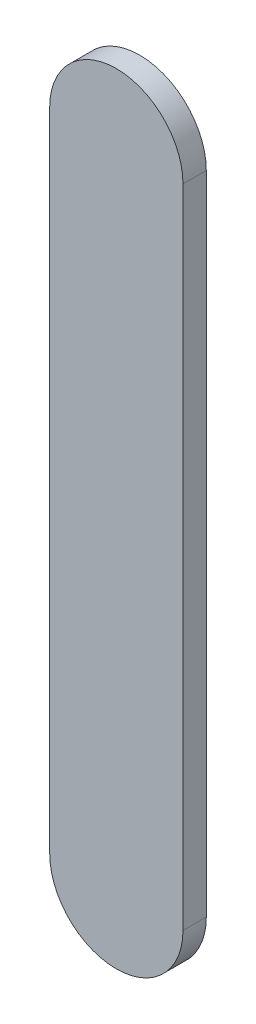
ISO-10303-21;
HEADER;
FILE_DESCRIPTION(('STEP AP214'),'2;1');
FILE_NAME('part.step','',(''),(''),'','','');
FILE_SCHEMA(('AUTOMOTIVE_DESIGN { 1 0 10303 214 1 1 1 1 }'));
ENDSEC;
DATA;
#1=APPLICATION_CONTEXT('core data for automotive mechanical design processes');
#2=APPLICATION_PROTOCOL_DEFINITION('international standard','automotive_design',2000,#1);
#3=PRODUCT_CONTEXT('',#1,'mechanical');
#4=PRODUCT('Part','Part','',(#3));
#5=PRODUCT_RELATED_PRODUCT_CATEGORY('part','',(#4));
#6=PRODUCT_DEFINITION_FORMATION('','',#4);
#7=PRODUCT_DEFINITION_CONTEXT('part definition',#1,'design');
#8=PRODUCT_DEFINITION('design','',#6,#7);
#9=PRODUCT_DEFINITION_SHAPE('','',#8);
#10=(LENGTH_UNIT() NAMED_UNIT(*) SI_UNIT(.MILLI.,.METRE.));
#11=(NAMED_UNIT(*) PLANE_ANGLE_UNIT() SI_UNIT($,.RADIAN.));
#12=(NAMED_UNIT(*) SI_UNIT($,.STERADIAN.) SOLID_ANGLE_UNIT());
#13=UNCERTAINTY_MEASURE_WITH_UNIT(LENGTH_MEASURE(1.E-05),#10,'distance_accuracy_value','');
#14=(GEOMETRIC_REPRESENTATION_CONTEXT(3) GLOBAL_UNCERTAINTY_ASSIGNED_CONTEXT((#13)) GLOBAL_UNIT_ASSIGNED_CONTEXT((#10,
#11,#12)) REPRESENTATION_CONTEXT('',''));
#15=CARTESIAN_POINT('',(0.,0.,0.));
#16=DIRECTION('',(0.,0.,1.));
#17=DIRECTION('',(1.,0.,0.));
#18=AXIS2_PLACEMENT_3D('',#15,#16,#17);
#19=CARTESIAN_POINT('',(82.2,-136.83,1.635));
#20=DIRECTION('',(0.,0.,1.));
#21=DIRECTION('',(1.,0.,0.));
#22=AXIS2_PLACEMENT_3D('',#19,#20,#21);
#23=PLANE('',#22);
#24=DIRECTION('',(0.,-1.,0.));
#25=VECTOR('',#24,1.);
#26=CARTESIAN_POINT('',(82.2,-136.83,1.635));
#27=LINE('',#26,#25);
#28=CARTESIAN_POINT('',(82.2,-136.83,1.635));
#29=VERTEX_POINT('',#28);
#30=CARTESIAN_POINT('',(82.2,-137.8,1.635));
#31=VERTEX_POINT('',#30);
#32=EDGE_CURVE('E80',#29,#31,#27,.T.);
#33=ORIENTED_EDGE('',*,*,#32,.T.);
#34=CARTESIAN_POINT('',(82.3,-137.8,1.635));
#35=DIRECTION('',(0.,0.,1.));
#36=DIRECTION('',(-1.,0.,0.));
#37=AXIS2_PLACEMENT_3D('',#34,#35,#36);
#38=CIRCLE('',#37,0.1);
#39=CARTESIAN_POINT('',(82.4,-137.8,1.635));
#40=VERTEX_POINT('',#39);
#41=EDGE_CURVE('E97',#31,#40,#38,.T.);
#42=ORIENTED_EDGE('',*,*,#41,.T.);
#43=DIRECTION('',(0.,1.,0.));
#44=VECTOR('',#43,1.);
#45=CARTESIAN_POINT('',(82.4,-137.8,1.635));
#46=LINE('',#45,#44);
#47=CARTESIAN_POINT('',(82.4,-136.83,1.635));
#48=VERTEX_POINT('',#47);
#49=EDGE_CURVE('E73',#40,#48,#46,.T.);
#50=ORIENTED_EDGE('',*,*,#49,.T.);
#51=CARTESIAN_POINT('',(82.3,-136.83,1.635));
#52=DIRECTION('',(0.,0.,1.));
#53=DIRECTION('',(1.,-2.84217094304E-13,0.));
#54=AXIS2_PLACEMENT_3D('',#51,#52,#53);
#55=CIRCLE('',#54,0.1);
#56=EDGE_CURVE('E11',#48,#29,#55,.T.);
#57=ORIENTED_EDGE('',*,*,#56,.T.);
#58=EDGE_LOOP('',(#33,#42,#50,#57));
#59=FACE_BOUND('',#58,.T.);
#60=ADVANCED_FACE('F17',(#59),#23,.T.);
#61=CARTESIAN_POINT('',(82.2,-136.83,1.6));
#62=DIRECTION('',(0.,0.,1.));
#63=DIRECTION('',(1.,0.,0.));
#64=AXIS2_PLACEMENT_3D('',#61,#62,#63);
#65=PLANE('',#64);
#66=CARTESIAN_POINT('',(82.3,-136.83,1.6));
#67=DIRECTION('',(0.,0.,1.));
#68=DIRECTION('',(1.,-2.84217094304E-13,0.));
#69=AXIS2_PLACEMENT_3D('',#66,#67,#68);
#70=CIRCLE('',#69,0.1);
#71=CARTESIAN_POINT('',(82.4,-136.83,1.6));
#72=VERTEX_POINT('',#71);
#73=CARTESIAN_POINT('',(82.2,-136.83,1.6));
#74=VERTEX_POINT('',#73);
#75=EDGE_CURVE('E27',#72,#74,#70,.T.);
#76=ORIENTED_EDGE('',*,*,#75,.F.);
#77=DIRECTION('',(0.,1.,0.));
#78=VECTOR('',#77,1.);
#79=CARTESIAN_POINT('',(82.4,-137.8,1.6));
#80=LINE('',#79,#78);
#81=CARTESIAN_POINT('',(82.4,-137.8,1.6));
#82=VERTEX_POINT('',#81);
#83=EDGE_CURVE('E101',#82,#72,#80,.T.);
#84=ORIENTED_EDGE('',*,*,#83,.F.);
#85=CARTESIAN_POINT('',(82.3,-137.8,1.6));
#86=DIRECTION('',(0.,0.,1.));
#87=DIRECTION('',(-1.,0.,0.));
#88=AXIS2_PLACEMENT_3D('',#85,#86,#87);
#89=CIRCLE('',#88,0.1);
#90=CARTESIAN_POINT('',(82.2,-137.8,1.6));
#91=VERTEX_POINT('',#90);
#92=EDGE_CURVE('E82',#91,#82,#89,.T.);
#93=ORIENTED_EDGE('',*,*,#92,.F.);
#94=DIRECTION('',(0.,-1.,0.));
#95=VECTOR('',#94,1.);
#96=CARTESIAN_POINT('',(82.2,-136.83,1.6));
#97=LINE('',#96,#95);
#98=EDGE_CURVE('E78',#74,#91,#97,.T.);
#99=ORIENTED_EDGE('',*,*,#98,.F.);
#100=EDGE_LOOP('',(#76,#84,#93,#99));
#101=FACE_BOUND('',#100,.T.);
#102=ADVANCED_FACE('F19',(#101),#65,.F.);
#103=CARTESIAN_POINT('',(82.3,-136.83,1.6));
#104=DIRECTION('',(0.,0.,-1.));
#105=DIRECTION('',(1.,-2.84217094304E-13,0.));
#106=AXIS2_PLACEMENT_3D('',#103,#104,#105);
#107=CYLINDRICAL_SURFACE('',#106,0.1);
#108=ORIENTED_EDGE('',*,*,#75,.T.);
#109=DIRECTION('',(0.,0.,1.));
#110=VECTOR('',#109,1.);
#111=CARTESIAN_POINT('',(82.2,-136.83,1.6));
#112=LINE('',#111,#110);
#113=EDGE_CURVE('E65',#74,#29,#112,.T.);
#114=ORIENTED_EDGE('',*,*,#113,.T.);
#115=ORIENTED_EDGE('',*,*,#56,.F.);
#116=DIRECTION('',(0.,0.,1.));
#117=VECTOR('',#116,1.);
#118=CARTESIAN_POINT('',(82.4,-136.83,1.6));
#119=LINE('',#118,#117);
#120=EDGE_CURVE('E68',#72,#48,#119,.T.);
#121=ORIENTED_EDGE('',*,*,#120,.F.);
#122=EDGE_LOOP('',(#108,#114,#115,#121));
#123=FACE_BOUND('',#122,.T.);
#124=ADVANCED_FACE('F64',(#123),#107,.T.);
#125=CARTESIAN_POINT('',(82.4,-137.8,1.6));
#126=DIRECTION('',(-1.,0.,0.));
#127=DIRECTION('',(0.,0.,1.));
#128=AXIS2_PLACEMENT_3D('',#125,#126,#127);
#129=PLANE('',#128);
#130=ORIENTED_EDGE('',*,*,#83,.T.);
#131=ORIENTED_EDGE('',*,*,#120,.T.);
#132=ORIENTED_EDGE('',*,*,#49,.F.);
#133=DIRECTION('',(0.,0.,1.));
#134=VECTOR('',#133,1.);
#135=CARTESIAN_POINT('',(82.4,-137.8,1.6));
#136=LINE('',#135,#134);
#137=EDGE_CURVE('E102',#82,#40,#136,.T.);
#138=ORIENTED_EDGE('',*,*,#137,.F.);
#139=EDGE_LOOP('',(#130,#131,#132,#138));
#140=FACE_BOUND('',#139,.T.);
#141=ADVANCED_FACE('F118',(#140),#129,.F.);
#142=CARTESIAN_POINT('',(82.3,-137.8,1.6));
#143=DIRECTION('',(0.,0.,-1.));
#144=DIRECTION('',(-1.,0.,0.));
#145=AXIS2_PLACEMENT_3D('',#142,#143,#144);
#146=CYLINDRICAL_SURFACE('',#145,0.1);
#147=ORIENTED_EDGE('',*,*,#92,.T.);
#148=ORIENTED_EDGE('',*,*,#137,.T.);
#149=ORIENTED_EDGE('',*,*,#41,.F.);
#150=DIRECTION('',(0.,0.,1.));
#151=VECTOR('',#150,1.);
#152=CARTESIAN_POINT('',(82.2,-137.8,1.6));
#153=LINE('',#152,#151);
#154=EDGE_CURVE('E87',#91,#31,#153,.T.);
#155=ORIENTED_EDGE('',*,*,#154,.F.);
#156=EDGE_LOOP('',(#147,#148,#149,#155));
#157=FACE_BOUND('',#156,.T.);
#158=ADVANCED_FACE('F120',(#157),#146,.T.);
#159=CARTESIAN_POINT('',(82.2,-136.83,1.6));
#160=DIRECTION('',(1.,0.,0.));
#161=DIRECTION('',(0.,1.,0.));
#162=AXIS2_PLACEMENT_3D('',#159,#160,#161);
#163=PLANE('',#162);
#164=ORIENTED_EDGE('',*,*,#98,.T.);
#165=ORIENTED_EDGE('',*,*,#154,.T.);
#166=ORIENTED_EDGE('',*,*,#32,.F.);
#167=ORIENTED_EDGE('',*,*,#113,.F.);
#168=EDGE_LOOP('',(#164,#165,#166,#167));
#169=FACE_BOUND('',#168,.T.);
#170=ADVANCED_FACE('F76',(#169),#163,.F.);
#171=CLOSED_SHELL('',(#60,#102,#124,#141,#158,#170));
#172=MANIFOLD_SOLID_BREP('B1',#171);
#173=ADVANCED_BREP_SHAPE_REPRESENTATION('',(#18,#172),#14);
#174=SHAPE_DEFINITION_REPRESENTATION(#9,#173);
ENDSEC;
END-ISO-10303-21;
